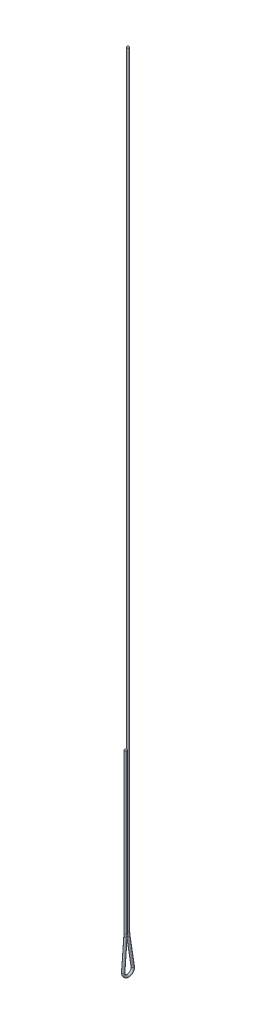
ISO-10303-21;
HEADER;
FILE_DESCRIPTION(('STEP AP214'),'2;1');
FILE_NAME('part.step','',(''),(''),'','','');
FILE_SCHEMA(('AUTOMOTIVE_DESIGN { 1 0 10303 214 1 1 1 1 }'));
ENDSEC;
DATA;
#1=APPLICATION_CONTEXT('core data for automotive mechanical design processes');
#2=APPLICATION_PROTOCOL_DEFINITION('international standard','automotive_design',2000,#1);
#3=PRODUCT_CONTEXT('',#1,'mechanical');
#4=PRODUCT('Part','Part','',(#3));
#5=PRODUCT_RELATED_PRODUCT_CATEGORY('part','',(#4));
#6=PRODUCT_DEFINITION_FORMATION('','',#4);
#7=PRODUCT_DEFINITION_CONTEXT('part definition',#1,'design');
#8=PRODUCT_DEFINITION('design','',#6,#7);
#9=PRODUCT_DEFINITION_SHAPE('','',#8);
#10=(LENGTH_UNIT() NAMED_UNIT(*) SI_UNIT(.MILLI.,.METRE.));
#11=(NAMED_UNIT(*) PLANE_ANGLE_UNIT() SI_UNIT($,.RADIAN.));
#12=(NAMED_UNIT(*) SI_UNIT($,.STERADIAN.) SOLID_ANGLE_UNIT());
#13=UNCERTAINTY_MEASURE_WITH_UNIT(LENGTH_MEASURE(1.E-05),#10,'distance_accuracy_value','');
#14=(GEOMETRIC_REPRESENTATION_CONTEXT(3) GLOBAL_UNCERTAINTY_ASSIGNED_CONTEXT((#13)) GLOBAL_UNIT_ASSIGNED_CONTEXT((#10,
#11,#12)) REPRESENTATION_CONTEXT('',''));
#15=CARTESIAN_POINT('',(0.,0.,0.));
#16=DIRECTION('',(0.,0.,1.));
#17=DIRECTION('',(1.,0.,0.));
#18=AXIS2_PLACEMENT_3D('',#15,#16,#17);
#19=CARTESIAN_POINT('',(0.,21.5085337780988,0.));
#20=DIRECTION('',(0.,1.,0.));
#21=DIRECTION('',(0.,0.,1.));
#22=AXIS2_PLACEMENT_3D('',#19,#20,#21);
#23=CYLINDRICAL_SURFACE('',#22,0.75);
#24=CARTESIAN_POINT('',(0.,21.5085337780988,0.));
#25=DIRECTION('',(0.,-1.,0.));
#26=DIRECTION('',(0.,0.,-1.));
#27=AXIS2_PLACEMENT_3D('',#24,#25,#26);
#28=CIRCLE('',#27,0.75);
#29=CARTESIAN_POINT('',(0.,21.5085337780989,0.749999999999997));
#30=VERTEX_POINT('',#29);
#31=EDGE_CURVE('E36',#30,#30,#28,.T.);
#32=ORIENTED_EDGE('',*,*,#31,.F.);
#33=EDGE_LOOP('',(#32));
#34=FACE_BOUND('',#33,.T.);
#35=CARTESIAN_POINT('',(0.,500.,0.));
#36=DIRECTION('',(0.,-1.,0.));
#37=DIRECTION('',(0.,0.,-1.));
#38=AXIS2_PLACEMENT_3D('',#35,#36,#37);
#39=CIRCLE('',#38,0.75);
#40=CARTESIAN_POINT('',(0.,500.,-0.750000000000002));
#41=VERTEX_POINT('',#40);
#42=EDGE_CURVE('E10',#41,#41,#39,.T.);
#43=ORIENTED_EDGE('',*,*,#42,.T.);
#44=EDGE_LOOP('',(#43));
#45=FACE_BOUND('',#44,.T.);
#46=ADVANCED_FACE('F30',(#34,#45),#23,.T.);
#47=CARTESIAN_POINT('',(0.,21.5085337780987,-20.));
#48=DIRECTION('',(-1.,0.,0.));
#49=DIRECTION('',(0.,0.,1.));
#50=AXIS2_PLACEMENT_3D('',#47,#48,#49);
#51=TOROIDAL_SURFACE('',#50,20.,0.75);
#52=CARTESIAN_POINT('',(0.,18.5085337780987,-0.22628006671482));
#53=DIRECTION('',(0.,-0.988685996664258,-0.150000000000006));
#54=DIRECTION('',(0.,0.150000000000006,-0.988685996664258));
#55=AXIS2_PLACEMENT_3D('',#52,#53,#54);
#56=CIRCLE('',#55,0.75);
#57=CARTESIAN_POINT('',(0.,18.3960337780987,0.515234430783374));
#58=VERTEX_POINT('',#57);
#59=EDGE_CURVE('E40',#58,#58,#56,.T.);
#60=CARTESIAN_POINT('',(0.,21.5085337780987,-20.));
#61=DIRECTION('',(-1.,0.,0.));
#62=DIRECTION('',(0.,0.,1.));
#63=AXIS2_PLACEMENT_3D('',#60,#61,#62);
#64=CIRCLE('',#63,20.75);
#65=EDGE_CURVE('',#58,#30,#64,.T.);
#66=ORIENTED_EDGE('',*,*,#59,.F.);
#67=ORIENTED_EDGE('',*,*,#31,.T.);
#68=ORIENTED_EDGE('',*,*,#65,.T.);
#69=ORIENTED_EDGE('',*,*,#65,.F.);
#70=EDGE_LOOP('',(#66,#68,#67,#69));
#71=FACE_BOUND('',#70,.T.);
#72=ADVANCED_FACE('F86',(#71),#51,.T.);
#73=CARTESIAN_POINT('',(0.,0.450000000000035,-2.96605798999278));
#74=DIRECTION('',(0.,0.988685996664259,0.15));
#75=DIRECTION('',(0.,-0.15,0.98868599666426));
#76=AXIS2_PLACEMENT_3D('',#73,#74,#75);
#77=CYLINDRICAL_SURFACE('',#76,0.75);
#78=CARTESIAN_POINT('',(0.,0.450000000000035,-2.96605798999278));
#79=DIRECTION('',(0.,-0.988685996664258,-0.150000000000006));
#80=DIRECTION('',(0.,0.150000000000006,-0.988685996664258));
#81=AXIS2_PLACEMENT_3D('',#78,#79,#80);
#82=CIRCLE('',#81,0.75);
#83=CARTESIAN_POINT('',(0.,0.562500000000044,-3.70757248749097));
#84=VERTEX_POINT('',#83);
#85=EDGE_CURVE('E44',#84,#84,#82,.T.);
#86=ORIENTED_EDGE('',*,*,#85,.F.);
#87=EDGE_LOOP('',(#86));
#88=FACE_BOUND('',#87,.T.);
#89=ORIENTED_EDGE('',*,*,#59,.T.);
#90=EDGE_LOOP('',(#89));
#91=FACE_BOUND('',#90,.T.);
#92=ADVANCED_FACE('F80',(#88,#91),#77,.T.);
#93=CARTESIAN_POINT('',(0.,0.,0.));
#94=DIRECTION('',(1.,0.,0.));
#95=DIRECTION('',(0.,0.,-1.));
#96=AXIS2_PLACEMENT_3D('',#93,#94,#95);
#97=TOROIDAL_SURFACE('',#96,3.,0.75);
#98=CARTESIAN_POINT('',(0.,0.225637304990103,2.99150260013205));
#99=DIRECTION('',(0.,0.997167533377349,-0.0752124349967062));
#100=DIRECTION('',(0.,0.0752124349967062,0.997167533377349));
#101=AXIS2_PLACEMENT_3D('',#98,#99,#100);
#102=CIRCLE('',#101,0.75);
#103=CARTESIAN_POINT('',(0.,0.282046631237629,3.73937825016506));
#104=VERTEX_POINT('',#103);
#105=EDGE_CURVE('E49',#104,#104,#102,.T.);
#106=CARTESIAN_POINT('',(0.,0.,0.));
#107=DIRECTION('',(1.,0.,0.));
#108=DIRECTION('',(0.,0.,-1.));
#109=AXIS2_PLACEMENT_3D('',#106,#107,#108);
#110=CIRCLE('',#109,3.75);
#111=EDGE_CURVE('',#104,#84,#110,.T.);
#112=ORIENTED_EDGE('',*,*,#105,.F.);
#113=ORIENTED_EDGE('',*,*,#85,.T.);
#114=ORIENTED_EDGE('',*,*,#111,.T.);
#115=ORIENTED_EDGE('',*,*,#111,.F.);
#116=EDGE_LOOP('',(#112,#114,#113,#115));
#117=FACE_BOUND('',#116,.T.);
#118=ADVANCED_FACE('F74',(#117),#97,.T.);
#119=CARTESIAN_POINT('',(0.,19.2489423442796,1.55664933245302));
#120=DIRECTION('',(0.,-0.99716753337735,0.0752124349966987));
#121=DIRECTION('',(0.,-0.0752124349966987,-0.99716753337735));
#122=AXIS2_PLACEMENT_3D('',#119,#120,#121);
#123=CYLINDRICAL_SURFACE('',#122,0.75);
#124=CARTESIAN_POINT('',(0.,19.2489423442796,1.55664933245302));
#125=DIRECTION('',(0.,0.997167533377349,-0.0752124349967062));
#126=DIRECTION('',(0.,0.0752124349967062,0.997167533377349));
#127=AXIS2_PLACEMENT_3D('',#124,#125,#126);
#128=CIRCLE('',#127,0.75);
#129=CARTESIAN_POINT('',(0.,19.192533018032,0.808773682420005));
#130=VERTEX_POINT('',#129);
#131=EDGE_CURVE('E52',#130,#130,#128,.T.);
#132=ORIENTED_EDGE('',*,*,#131,.F.);
#133=EDGE_LOOP('',(#132));
#134=FACE_BOUND('',#133,.T.);
#135=ORIENTED_EDGE('',*,*,#105,.T.);
#136=EDGE_LOOP('',(#135));
#137=FACE_BOUND('',#136,.T.);
#138=ADVANCED_FACE('F68',(#134,#137),#123,.T.);
#139=CARTESIAN_POINT('',(0.,20.7531910442136,21.5));
#140=DIRECTION('',(-1.,0.,0.));
#141=DIRECTION('',(0.,0.,1.));
#142=AXIS2_PLACEMENT_3D('',#139,#140,#141);
#143=TOROIDAL_SURFACE('',#142,20.,0.75);
#144=CARTESIAN_POINT('',(0.,20.7531910442137,1.5));
#145=DIRECTION('',(0.,1.,0.));
#146=DIRECTION('',(0.,0.,1.));
#147=AXIS2_PLACEMENT_3D('',#144,#145,#146);
#148=CIRCLE('',#147,0.75);
#149=CARTESIAN_POINT('',(0.,20.7531910442137,0.750000000000001));
#150=VERTEX_POINT('',#149);
#151=EDGE_CURVE('E55',#150,#150,#148,.T.);
#152=CARTESIAN_POINT('',(0.,20.7531910442136,21.5));
#153=DIRECTION('',(-1.,0.,0.));
#154=DIRECTION('',(0.,0.,1.));
#155=AXIS2_PLACEMENT_3D('',#152,#153,#154);
#156=CIRCLE('',#155,20.75);
#157=EDGE_CURVE('',#150,#130,#156,.T.);
#158=ORIENTED_EDGE('',*,*,#151,.F.);
#159=ORIENTED_EDGE('',*,*,#131,.T.);
#160=ORIENTED_EDGE('',*,*,#157,.T.);
#161=ORIENTED_EDGE('',*,*,#157,.F.);
#162=EDGE_LOOP('',(#158,#160,#159,#161));
#163=FACE_BOUND('',#162,.T.);
#164=ADVANCED_FACE('F65',(#163),#143,.T.);
#165=CARTESIAN_POINT('',(0.,20.7531910442137,1.5));
#166=DIRECTION('',(0.,1.,0.));
#167=DIRECTION('',(0.,0.,1.));
#168=AXIS2_PLACEMENT_3D('',#165,#166,#167);
#169=CYLINDRICAL_SURFACE('',#168,0.75);
#170=ORIENTED_EDGE('',*,*,#151,.T.);
#171=EDGE_LOOP('',(#170));
#172=FACE_BOUND('',#171,.T.);
#173=CARTESIAN_POINT('',(0.,120.,1.5));
#174=DIRECTION('',(0.,1.,0.));
#175=DIRECTION('',(0.,0.,1.));
#176=AXIS2_PLACEMENT_3D('',#173,#174,#175);
#177=CIRCLE('',#176,0.75);
#178=CARTESIAN_POINT('',(0.,120.,2.25));
#179=VERTEX_POINT('',#178);
#180=EDGE_CURVE('E56',#179,#179,#177,.T.);
#181=ORIENTED_EDGE('',*,*,#180,.F.);
#182=EDGE_LOOP('',(#181));
#183=FACE_BOUND('',#182,.T.);
#184=ADVANCED_FACE('F62',(#172,#183),#169,.T.);
#185=CARTESIAN_POINT('',(0.,500.,0.));
#186=DIRECTION('',(0.,-1.,0.));
#187=DIRECTION('',(0.,0.,-1.));
#188=AXIS2_PLACEMENT_3D('',#185,#186,#187);
#189=PLANE('',#188);
#190=ORIENTED_EDGE('',*,*,#42,.F.);
#191=EDGE_LOOP('',(#190));
#192=FACE_BOUND('',#191,.T.);
#193=ADVANCED_FACE('F98',(#192),#189,.F.);
#194=CARTESIAN_POINT('',(0.,120.,1.5));
#195=DIRECTION('',(0.,1.,0.));
#196=DIRECTION('',(0.,0.,1.));
#197=AXIS2_PLACEMENT_3D('',#194,#195,#196);
#198=PLANE('',#197);
#199=ORIENTED_EDGE('',*,*,#180,.T.);
#200=EDGE_LOOP('',(#199));
#201=FACE_BOUND('',#200,.T.);
#202=ADVANCED_FACE('F99',(#201),#198,.T.);
#203=CLOSED_SHELL('',(#46,#72,#92,#118,#138,#164,#184,#193,#202));
#204=MANIFOLD_SOLID_BREP('B2',#203);
#205=ADVANCED_BREP_SHAPE_REPRESENTATION('',(#18,#204),#14);
#206=SHAPE_DEFINITION_REPRESENTATION(#9,#205);
ENDSEC;
END-ISO-10303-21;
